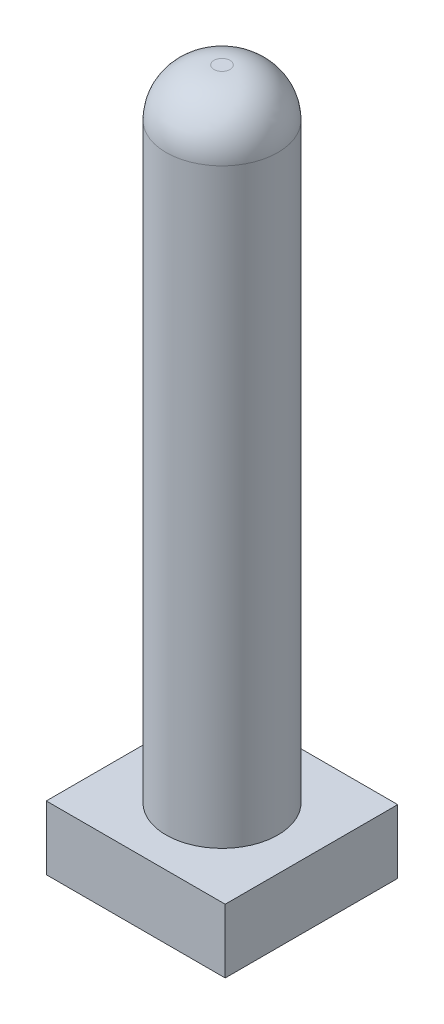
ISO-10303-21;
HEADER;
FILE_DESCRIPTION(('STEP AP214'),'2;1');
FILE_NAME('part.step','',(''),(''),'','','');
FILE_SCHEMA(('AUTOMOTIVE_DESIGN { 1 0 10303 214 1 1 1 1 }'));
ENDSEC;
DATA;
#1=APPLICATION_CONTEXT('core data for automotive mechanical design processes');
#2=APPLICATION_PROTOCOL_DEFINITION('international standard','automotive_design',2000,#1);
#3=PRODUCT_CONTEXT('',#1,'mechanical');
#4=PRODUCT('Part','Part','',(#3));
#5=PRODUCT_RELATED_PRODUCT_CATEGORY('part','',(#4));
#6=PRODUCT_DEFINITION_FORMATION('','',#4);
#7=PRODUCT_DEFINITION_CONTEXT('part definition',#1,'design');
#8=PRODUCT_DEFINITION('design','',#6,#7);
#9=PRODUCT_DEFINITION_SHAPE('','',#8);
#10=(LENGTH_UNIT() NAMED_UNIT(*) SI_UNIT(.MILLI.,.METRE.));
#11=(NAMED_UNIT(*) PLANE_ANGLE_UNIT() SI_UNIT($,.RADIAN.));
#12=(NAMED_UNIT(*) SI_UNIT($,.STERADIAN.) SOLID_ANGLE_UNIT());
#13=UNCERTAINTY_MEASURE_WITH_UNIT(LENGTH_MEASURE(1.E-05),#10,'distance_accuracy_value','');
#14=(GEOMETRIC_REPRESENTATION_CONTEXT(3) GLOBAL_UNCERTAINTY_ASSIGNED_CONTEXT((#13)) GLOBAL_UNIT_ASSIGNED_CONTEXT((#10,
#11,#12)) REPRESENTATION_CONTEXT('',''));
#15=CARTESIAN_POINT('',(0.,0.,0.));
#16=DIRECTION('',(0.,0.,1.));
#17=DIRECTION('',(1.,0.,0.));
#18=AXIS2_PLACEMENT_3D('',#15,#16,#17);
#19=CARTESIAN_POINT('',(2.8,2.,2.7));
#20=DIRECTION('',(-1.,0.,0.));
#21=DIRECTION('',(0.,0.,1.));
#22=AXIS2_PLACEMENT_3D('',#19,#20,#21);
#23=PLANE('',#22);
#24=DIRECTION('',(0.,0.,-1.));
#25=VECTOR('',#24,1.);
#26=CARTESIAN_POINT('',(2.8,0.,2.7));
#27=LINE('',#26,#25);
#28=CARTESIAN_POINT('',(2.8,0.,2.7));
#29=VERTEX_POINT('',#28);
#30=CARTESIAN_POINT('',(2.8,0.,-2.7));
#31=VERTEX_POINT('',#30);
#32=EDGE_CURVE('E113',#29,#31,#27,.T.);
#33=ORIENTED_EDGE('',*,*,#32,.T.);
#34=DIRECTION('',(0.,-1.,0.));
#35=VECTOR('',#34,1.);
#36=CARTESIAN_POINT('',(2.8,2.,-2.7));
#37=LINE('',#36,#35);
#38=CARTESIAN_POINT('',(2.8,2.,-2.7));
#39=VERTEX_POINT('',#38);
#40=EDGE_CURVE('E102',#39,#31,#37,.T.);
#41=ORIENTED_EDGE('',*,*,#40,.F.);
#42=DIRECTION('',(0.,0.,-1.));
#43=VECTOR('',#42,1.);
#44=CARTESIAN_POINT('',(2.8,2.,2.7));
#45=LINE('',#44,#43);
#46=CARTESIAN_POINT('',(2.8,2.,2.7));
#47=VERTEX_POINT('',#46);
#48=EDGE_CURVE('E94',#47,#39,#45,.T.);
#49=ORIENTED_EDGE('',*,*,#48,.F.);
#50=DIRECTION('',(0.,-1.,0.));
#51=VECTOR('',#50,1.);
#52=CARTESIAN_POINT('',(2.8,2.,2.7));
#53=LINE('',#52,#51);
#54=EDGE_CURVE('E109',#47,#29,#53,.T.);
#55=ORIENTED_EDGE('',*,*,#54,.T.);
#56=EDGE_LOOP('',(#33,#41,#49,#55));
#57=FACE_BOUND('',#56,.T.);
#58=ADVANCED_FACE('F39',(#57),#23,.F.);
#59=CARTESIAN_POINT('',(-2.8,2.,-2.7));
#60=DIRECTION('',(0.,0.,1.));
#61=DIRECTION('',(1.,0.,0.));
#62=AXIS2_PLACEMENT_3D('',#59,#60,#61);
#63=PLANE('',#62);
#64=DIRECTION('',(-1.,0.,0.));
#65=VECTOR('',#64,1.);
#66=CARTESIAN_POINT('',(-2.8,0.,-2.7));
#67=LINE('',#66,#65);
#68=CARTESIAN_POINT('',(-2.8,0.,-2.7));
#69=VERTEX_POINT('',#68);
#70=EDGE_CURVE('E100',#31,#69,#67,.T.);
#71=ORIENTED_EDGE('',*,*,#70,.T.);
#72=DIRECTION('',(0.,-1.,0.));
#73=VECTOR('',#72,1.);
#74=CARTESIAN_POINT('',(-2.8,2.,-2.7));
#75=LINE('',#74,#73);
#76=CARTESIAN_POINT('',(-2.8,2.,-2.7));
#77=VERTEX_POINT('',#76);
#78=EDGE_CURVE('E98',#77,#69,#75,.T.);
#79=ORIENTED_EDGE('',*,*,#78,.F.);
#80=DIRECTION('',(-1.,0.,0.));
#81=VECTOR('',#80,1.);
#82=CARTESIAN_POINT('',(-2.8,2.,-2.7));
#83=LINE('',#82,#81);
#84=EDGE_CURVE('E89',#39,#77,#83,.T.);
#85=ORIENTED_EDGE('',*,*,#84,.F.);
#86=ORIENTED_EDGE('',*,*,#40,.T.);
#87=EDGE_LOOP('',(#71,#79,#85,#86));
#88=FACE_BOUND('',#87,.T.);
#89=ADVANCED_FACE('F99',(#88),#63,.F.);
#90=CARTESIAN_POINT('',(-2.8,2.,2.7));
#91=DIRECTION('',(1.,0.,0.));
#92=DIRECTION('',(0.,0.,-1.));
#93=AXIS2_PLACEMENT_3D('',#90,#91,#92);
#94=PLANE('',#93);
#95=DIRECTION('',(0.,0.,1.));
#96=VECTOR('',#95,1.);
#97=CARTESIAN_POINT('',(-2.8,0.,2.7));
#98=LINE('',#97,#96);
#99=CARTESIAN_POINT('',(-2.8,0.,2.7));
#100=VERTEX_POINT('',#99);
#101=EDGE_CURVE('E75',#69,#100,#98,.T.);
#102=ORIENTED_EDGE('',*,*,#101,.T.);
#103=DIRECTION('',(0.,-1.,0.));
#104=VECTOR('',#103,1.);
#105=CARTESIAN_POINT('',(-2.8,2.,2.7));
#106=LINE('',#105,#104);
#107=CARTESIAN_POINT('',(-2.8,2.,2.7));
#108=VERTEX_POINT('',#107);
#109=EDGE_CURVE('E103',#108,#100,#106,.T.);
#110=ORIENTED_EDGE('',*,*,#109,.F.);
#111=DIRECTION('',(0.,0.,1.));
#112=VECTOR('',#111,1.);
#113=CARTESIAN_POINT('',(-2.8,2.,2.7));
#114=LINE('',#113,#112);
#115=EDGE_CURVE('E92',#77,#108,#114,.T.);
#116=ORIENTED_EDGE('',*,*,#115,.F.);
#117=ORIENTED_EDGE('',*,*,#78,.T.);
#118=EDGE_LOOP('',(#102,#110,#116,#117));
#119=FACE_BOUND('',#118,.T.);
#120=ADVANCED_FACE('F105',(#119),#94,.F.);
#121=CARTESIAN_POINT('',(-2.8,2.,2.7));
#122=DIRECTION('',(0.,0.,-1.));
#123=DIRECTION('',(-1.,0.,0.));
#124=AXIS2_PLACEMENT_3D('',#121,#122,#123);
#125=PLANE('',#124);
#126=DIRECTION('',(1.,0.,0.));
#127=VECTOR('',#126,1.);
#128=CARTESIAN_POINT('',(-2.8,0.,2.7));
#129=LINE('',#128,#127);
#130=EDGE_CURVE('E81',#100,#29,#129,.T.);
#131=ORIENTED_EDGE('',*,*,#130,.T.);
#132=ORIENTED_EDGE('',*,*,#54,.F.);
#133=DIRECTION('',(1.,0.,0.));
#134=VECTOR('',#133,1.);
#135=CARTESIAN_POINT('',(-2.8,2.,2.7));
#136=LINE('',#135,#134);
#137=EDGE_CURVE('E58',#108,#47,#136,.T.);
#138=ORIENTED_EDGE('',*,*,#137,.F.);
#139=ORIENTED_EDGE('',*,*,#109,.T.);
#140=EDGE_LOOP('',(#131,#132,#138,#139));
#141=FACE_BOUND('',#140,.T.);
#142=ADVANCED_FACE('F162',(#141),#125,.F.);
#143=CARTESIAN_POINT('',(0.,2.,0.));
#144=DIRECTION('',(0.,-1.,0.));
#145=DIRECTION('',(0.,0.,-1.));
#146=AXIS2_PLACEMENT_3D('',#143,#144,#145);
#147=PLANE('',#146);
#148=CARTESIAN_POINT('',(0.,2.,0.));
#149=DIRECTION('',(0.,-1.,0.));
#150=DIRECTION('',(0.,0.,-1.));
#151=AXIS2_PLACEMENT_3D('',#148,#149,#150);
#152=CIRCLE('',#151,1.75);
#153=CARTESIAN_POINT('',(0.,2.,-1.75));
#154=VERTEX_POINT('',#153);
#155=EDGE_CURVE('E130',#154,#154,#152,.F.);
#156=ORIENTED_EDGE('',*,*,#155,.F.);
#157=EDGE_LOOP('',(#156));
#158=FACE_BOUND('',#157,.T.);
#159=ORIENTED_EDGE('',*,*,#48,.T.);
#160=ORIENTED_EDGE('',*,*,#84,.T.);
#161=ORIENTED_EDGE('',*,*,#115,.T.);
#162=ORIENTED_EDGE('',*,*,#137,.T.);
#163=EDGE_LOOP('',(#159,#160,#161,#162));
#164=FACE_BOUND('',#163,.T.);
#165=ADVANCED_FACE('F90',(#158,#164),#147,.F.);
#166=CARTESIAN_POINT('',(0.,0.,0.));
#167=DIRECTION('',(0.,-1.,0.));
#168=DIRECTION('',(0.,0.,-1.));
#169=AXIS2_PLACEMENT_3D('',#166,#167,#168);
#170=PLANE('',#169);
#171=CARTESIAN_POINT('',(0.,0.,0.));
#172=DIRECTION('',(0.,-1.,0.));
#173=DIRECTION('',(0.,0.,-1.));
#174=AXIS2_PLACEMENT_3D('',#171,#172,#173);
#175=CIRCLE('',#174,1.2);
#176=CARTESIAN_POINT('',(0.,0.,-1.2));
#177=VERTEX_POINT('',#176);
#178=EDGE_CURVE('E194',#177,#177,#175,.T.);
#179=ORIENTED_EDGE('',*,*,#178,.F.);
#180=EDGE_LOOP('',(#179));
#181=FACE_BOUND('',#180,.T.);
#182=ORIENTED_EDGE('',*,*,#32,.F.);
#183=ORIENTED_EDGE('',*,*,#130,.F.);
#184=ORIENTED_EDGE('',*,*,#101,.F.);
#185=ORIENTED_EDGE('',*,*,#70,.F.);
#186=EDGE_LOOP('',(#182,#183,#184,#185));
#187=FACE_BOUND('',#186,.T.);
#188=ADVANCED_FACE('F165',(#181,#187),#170,.T.);
#189=CARTESIAN_POINT('',(0.,2.8,0.));
#190=DIRECTION('',(0.,-1.,0.));
#191=DIRECTION('',(0.,0.,-1.));
#192=AXIS2_PLACEMENT_3D('',#189,#190,#191);
#193=CYLINDRICAL_SURFACE('',#192,1.2);
#194=ORIENTED_EDGE('',*,*,#178,.T.);
#195=EDGE_LOOP('',(#194));
#196=FACE_BOUND('',#195,.T.);
#197=CARTESIAN_POINT('',(0.,2.,0.));
#198=DIRECTION('',(0.,-1.,0.));
#199=DIRECTION('',(0.,0.,-1.));
#200=AXIS2_PLACEMENT_3D('',#197,#198,#199);
#201=CIRCLE('',#200,1.2);
#202=CARTESIAN_POINT('',(0.,2.,-1.2));
#203=VERTEX_POINT('',#202);
#204=EDGE_CURVE('E117',#203,#203,#201,.T.);
#205=ORIENTED_EDGE('',*,*,#204,.F.);
#206=EDGE_LOOP('',(#205));
#207=FACE_BOUND('',#206,.T.);
#208=ADVANCED_FACE('F168',(#196,#207),#193,.F.);
#209=CARTESIAN_POINT('',(0.,2.,0.));
#210=DIRECTION('',(0.,1.,0.));
#211=DIRECTION('',(0.,0.,1.));
#212=AXIS2_PLACEMENT_3D('',#209,#210,#211);
#213=PLANE('',#212);
#214=CARTESIAN_POINT('',(0.,2.,0.));
#215=DIRECTION('',(0.,1.,0.));
#216=DIRECTION('',(0.,0.,1.));
#217=AXIS2_PLACEMENT_3D('',#214,#215,#216);
#218=CIRCLE('',#217,0.95);
#219=CARTESIAN_POINT('',(0.,2.,0.95));
#220=VERTEX_POINT('',#219);
#221=EDGE_CURVE('E43',#220,#220,#218,.T.);
#222=ORIENTED_EDGE('',*,*,#221,.T.);
#223=EDGE_LOOP('',(#222));
#224=FACE_BOUND('',#223,.T.);
#225=ORIENTED_EDGE('',*,*,#204,.T.);
#226=EDGE_LOOP('',(#225));
#227=FACE_BOUND('',#226,.T.);
#228=ADVANCED_FACE('F175',(#224,#227),#213,.F.);
#229=CARTESIAN_POINT('',(0.,22.,0.));
#230=DIRECTION('',(0.,-1.,0.));
#231=DIRECTION('',(0.,0.,-1.));
#232=AXIS2_PLACEMENT_3D('',#229,#230,#231);
#233=CYLINDRICAL_SURFACE('',#232,1.75);
#234=CARTESIAN_POINT('',(0.,20.5,0.));
#235=DIRECTION('',(0.,1.,0.));
#236=DIRECTION('',(0.,0.,1.));
#237=AXIS2_PLACEMENT_3D('',#234,#235,#236);
#238=CIRCLE('',#237,1.75);
#239=CARTESIAN_POINT('',(0.,20.5,1.75));
#240=VERTEX_POINT('',#239);
#241=EDGE_CURVE('E11',#240,#240,#238,.F.);
#242=ORIENTED_EDGE('',*,*,#241,.T.);
#243=EDGE_LOOP('',(#242));
#244=FACE_BOUND('',#243,.T.);
#245=ORIENTED_EDGE('',*,*,#155,.T.);
#246=EDGE_LOOP('',(#245));
#247=FACE_BOUND('',#246,.T.);
#248=ADVANCED_FACE('F150',(#244,#247),#233,.T.);
#249=CARTESIAN_POINT('',(0.,22.,0.));
#250=DIRECTION('',(0.,1.,0.));
#251=DIRECTION('',(0.,0.,1.));
#252=AXIS2_PLACEMENT_3D('',#249,#250,#251);
#253=PLANE('',#252);
#254=CARTESIAN_POINT('',(0.,22.,0.));
#255=DIRECTION('',(0.,1.,0.));
#256=DIRECTION('',(0.,0.,1.));
#257=AXIS2_PLACEMENT_3D('',#254,#255,#256);
#258=CIRCLE('',#257,0.25);
#259=CARTESIAN_POINT('',(0.,22.,0.25));
#260=VERTEX_POINT('',#259);
#261=EDGE_CURVE('E50',#260,#260,#258,.T.);
#262=ORIENTED_EDGE('',*,*,#261,.T.);
#263=EDGE_LOOP('',(#262));
#264=FACE_BOUND('',#263,.T.);
#265=ADVANCED_FACE('F138',(#264),#253,.T.);
#266=CARTESIAN_POINT('',(0.,20.5,0.));
#267=DIRECTION('',(0.,1.,0.));
#268=DIRECTION('',(0.,0.,1.));
#269=AXIS2_PLACEMENT_3D('',#266,#267,#268);
#270=DEGENERATE_TOROIDAL_SURFACE('',#269,0.25,1.5,.T.);
#271=ORIENTED_EDGE('',*,*,#241,.F.);
#272=EDGE_LOOP('',(#271));
#273=FACE_BOUND('',#272,.T.);
#274=ORIENTED_EDGE('',*,*,#261,.F.);
#275=EDGE_LOOP('',(#274));
#276=FACE_BOUND('',#275,.T.);
#277=ADVANCED_FACE('F41',(#273,#276),#270,.T.);
#278=CARTESIAN_POINT('',(0.,9.5,0.));
#279=DIRECTION('',(0.,-1.,0.));
#280=DIRECTION('',(0.,0.,-1.));
#281=AXIS2_PLACEMENT_3D('',#278,#279,#280);
#282=CYLINDRICAL_SURFACE('',#281,0.95);
#283=CARTESIAN_POINT('',(0.,9.5,0.));
#284=DIRECTION('',(0.,-1.,0.));
#285=DIRECTION('',(0.,0.,-1.));
#286=AXIS2_PLACEMENT_3D('',#283,#284,#285);
#287=CIRCLE('',#286,0.95);
#288=CARTESIAN_POINT('',(0.,9.5,-0.95));
#289=VERTEX_POINT('',#288);
#290=EDGE_CURVE('E189',#289,#289,#287,.T.);
#291=ORIENTED_EDGE('',*,*,#290,.F.);
#292=EDGE_LOOP('',(#291));
#293=FACE_BOUND('',#292,.T.);
#294=ORIENTED_EDGE('',*,*,#221,.F.);
#295=EDGE_LOOP('',(#294));
#296=FACE_BOUND('',#295,.T.);
#297=ADVANCED_FACE('F141',(#293,#296),#282,.F.);
#298=CARTESIAN_POINT('',(0.,9.5,0.));
#299=DIRECTION('',(0.,-1.,0.));
#300=DIRECTION('',(0.,0.,-1.));
#301=AXIS2_PLACEMENT_3D('',#298,#299,#300);
#302=PLANE('',#301);
#303=ORIENTED_EDGE('',*,*,#290,.T.);
#304=EDGE_LOOP('',(#303));
#305=FACE_BOUND('',#304,.T.);
#306=ADVANCED_FACE('F147',(#305),#302,.T.);
#307=CLOSED_SHELL('',(#58,#89,#120,#142,#165,#188,#208,#228,#248,#265,#277,#297,#306));
#308=MANIFOLD_SOLID_BREP('B2',#307);
#309=ADVANCED_BREP_SHAPE_REPRESENTATION('',(#18,#308),#14);
#310=SHAPE_DEFINITION_REPRESENTATION(#9,#309);
ENDSEC;
END-ISO-10303-21;
